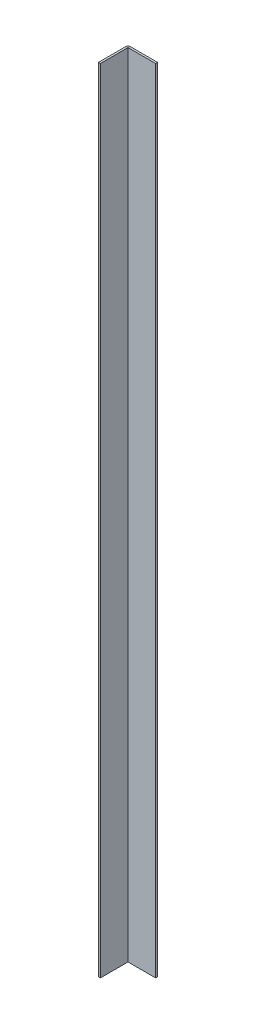
ISO-10303-21;
HEADER;
FILE_DESCRIPTION(('STEP AP214'),'2;1');
FILE_NAME('part.step','',(''),(''),'','','');
FILE_SCHEMA(('AUTOMOTIVE_DESIGN { 1 0 10303 214 1 1 1 1 }'));
ENDSEC;
DATA;
#1=APPLICATION_CONTEXT('core data for automotive mechanical design processes');
#2=APPLICATION_PROTOCOL_DEFINITION('international standard','automotive_design',2000,#1);
#3=PRODUCT_CONTEXT('',#1,'mechanical');
#4=PRODUCT('Part','Part','',(#3));
#5=PRODUCT_RELATED_PRODUCT_CATEGORY('part','',(#4));
#6=PRODUCT_DEFINITION_FORMATION('','',#4);
#7=PRODUCT_DEFINITION_CONTEXT('part definition',#1,'design');
#8=PRODUCT_DEFINITION('design','',#6,#7);
#9=PRODUCT_DEFINITION_SHAPE('','',#8);
#10=(LENGTH_UNIT() NAMED_UNIT(*) SI_UNIT(.MILLI.,.METRE.));
#11=(NAMED_UNIT(*) PLANE_ANGLE_UNIT() SI_UNIT($,.RADIAN.));
#12=(NAMED_UNIT(*) SI_UNIT($,.STERADIAN.) SOLID_ANGLE_UNIT());
#13=UNCERTAINTY_MEASURE_WITH_UNIT(LENGTH_MEASURE(1.E-05),#10,'distance_accuracy_value','');
#14=(GEOMETRIC_REPRESENTATION_CONTEXT(3) GLOBAL_UNCERTAINTY_ASSIGNED_CONTEXT((#13)) GLOBAL_UNIT_ASSIGNED_CONTEXT((#10,
#11,#12)) REPRESENTATION_CONTEXT('',''));
#15=CARTESIAN_POINT('',(0.,0.,0.));
#16=DIRECTION('',(0.,0.,1.));
#17=DIRECTION('',(1.,0.,0.));
#18=AXIS2_PLACEMENT_3D('',#15,#16,#17);
#19=CARTESIAN_POINT('',(-1240.,521.213203435596,850.482879267258));
#20=DIRECTION('',(1.,0.,0.));
#21=DIRECTION('',(0.,0.,-1.));
#22=AXIS2_PLACEMENT_3D('',#19,#20,#21);
#23=PLANE('',#22);
#24=DIRECTION('',(0.,0.,-1.));
#25=VECTOR('',#24,1.);
#26=CARTESIAN_POINT('',(-1240.,100.,850.482879267258));
#27=LINE('',#26,#25);
#28=CARTESIAN_POINT('',(-1240.,100.,50.9999999999999));
#29=VERTEX_POINT('',#28);
#30=CARTESIAN_POINT('',(-1240.,100.,50.));
#31=VERTEX_POINT('',#30);
#32=EDGE_CURVE('E185',#29,#31,#27,.T.);
#33=ORIENTED_EDGE('',*,*,#32,.T.);
#34=DIRECTION('',(0.,-1.,0.));
#35=VECTOR('',#34,1.);
#36=CARTESIAN_POINT('',(-1240.,521.213203435596,49.9999999999998));
#37=LINE('',#36,#35);
#38=CARTESIAN_POINT('',(-1240.,500.,49.9999999999998));
#39=VERTEX_POINT('',#38);
#40=EDGE_CURVE('E161',#39,#31,#37,.T.);
#41=ORIENTED_EDGE('',*,*,#40,.F.);
#42=DIRECTION('',(0.,0.,-1.));
#43=VECTOR('',#42,1.);
#44=CARTESIAN_POINT('',(-1240.,500.,850.482879267258));
#45=LINE('',#44,#43);
#46=CARTESIAN_POINT('',(-1240.,500.,51.0000000000002));
#47=VERTEX_POINT('',#46);
#48=EDGE_CURVE('E247',#47,#39,#45,.T.);
#49=ORIENTED_EDGE('',*,*,#48,.F.);
#50=DIRECTION('',(0.,-1.,0.));
#51=VECTOR('',#50,1.);
#52=CARTESIAN_POINT('',(-1240.,521.213203435596,50.9999999999999));
#53=LINE('',#52,#51);
#54=EDGE_CURVE('E77',#47,#29,#53,.T.);
#55=ORIENTED_EDGE('',*,*,#54,.T.);
#56=EDGE_LOOP('',(#33,#41,#49,#55));
#57=FACE_BOUND('',#56,.T.);
#58=ADVANCED_FACE('F53',(#57),#23,.T.);
#59=CARTESIAN_POINT('',(-1255.,100.,850.482879267258));
#60=DIRECTION('',(0.,1.,0.));
#61=DIRECTION('',(-1.,0.,0.));
#62=AXIS2_PLACEMENT_3D('',#59,#60,#61);
#63=PLANE('',#62);
#64=DIRECTION('',(1.,0.,0.));
#65=VECTOR('',#64,1.);
#66=CARTESIAN_POINT('',(-1255.,100.,49.9999999999998));
#67=LINE('',#66,#65);
#68=CARTESIAN_POINT('',(-1253.9,100.,50.));
#69=VERTEX_POINT('',#68);
#70=EDGE_CURVE('E152',#69,#31,#67,.T.);
#71=ORIENTED_EDGE('',*,*,#70,.T.);
#72=ORIENTED_EDGE('',*,*,#32,.F.);
#73=DIRECTION('',(1.,0.,0.));
#74=VECTOR('',#73,1.);
#75=CARTESIAN_POINT('',(-1255.,100.,50.9999999999999));
#76=LINE('',#75,#74);
#77=CARTESIAN_POINT('',(-1253.9,100.,50.9999999999999));
#78=VERTEX_POINT('',#77);
#79=EDGE_CURVE('E12',#78,#29,#76,.T.);
#80=ORIENTED_EDGE('',*,*,#79,.F.);
#81=DIRECTION('',(0.,0.,-1.));
#82=VECTOR('',#81,1.);
#83=CARTESIAN_POINT('',(-1253.9,100.,850.482879267258));
#84=LINE('',#83,#82);
#85=EDGE_CURVE('E166',#78,#69,#84,.T.);
#86=ORIENTED_EDGE('',*,*,#85,.T.);
#87=EDGE_LOOP('',(#71,#72,#80,#86));
#88=FACE_BOUND('',#87,.T.);
#89=ADVANCED_FACE('F169',(#88),#63,.F.);
#90=CARTESIAN_POINT('',(-1255.,521.213203435596,49.9999999999998));
#91=DIRECTION('',(0.,0.,-1.));
#92=DIRECTION('',(-1.,0.,0.));
#93=AXIS2_PLACEMENT_3D('',#90,#91,#92);
#94=PLANE('',#93);
#95=DIRECTION('',(0.,-1.,0.));
#96=VECTOR('',#95,1.);
#97=CARTESIAN_POINT('',(-1253.9,100.,49.9999999999998));
#98=LINE('',#97,#96);
#99=CARTESIAN_POINT('',(-1253.9,500.,50.));
#100=VERTEX_POINT('',#99);
#101=EDGE_CURVE('E158',#100,#69,#98,.T.);
#102=ORIENTED_EDGE('',*,*,#101,.F.);
#103=DIRECTION('',(-1.,0.,0.));
#104=VECTOR('',#103,1.);
#105=CARTESIAN_POINT('',(-1255.,500.,49.9999999999998));
#106=LINE('',#105,#104);
#107=EDGE_CURVE('E250',#39,#100,#106,.T.);
#108=ORIENTED_EDGE('',*,*,#107,.F.);
#109=ORIENTED_EDGE('',*,*,#40,.T.);
#110=ORIENTED_EDGE('',*,*,#70,.F.);
#111=EDGE_LOOP('',(#102,#108,#109,#110));
#112=FACE_BOUND('',#111,.T.);
#113=ADVANCED_FACE('F155',(#112),#94,.T.);
#114=CARTESIAN_POINT('',(-1255.,500.,850.482879267258));
#115=DIRECTION('',(0.,-1.,0.));
#116=DIRECTION('',(1.,0.,0.));
#117=AXIS2_PLACEMENT_3D('',#114,#115,#116);
#118=PLANE('',#117);
#119=ORIENTED_EDGE('',*,*,#107,.T.);
#120=DIRECTION('',(0.,0.,-1.));
#121=VECTOR('',#120,1.);
#122=CARTESIAN_POINT('',(-1253.9,500.,850.482879267258));
#123=LINE('',#122,#121);
#124=CARTESIAN_POINT('',(-1253.9,500.,50.9999999999999));
#125=VERTEX_POINT('',#124);
#126=EDGE_CURVE('E58',#125,#100,#123,.T.);
#127=ORIENTED_EDGE('',*,*,#126,.F.);
#128=DIRECTION('',(-1.,0.,0.));
#129=VECTOR('',#128,1.);
#130=CARTESIAN_POINT('',(-1255.,500.,50.9999999999999));
#131=LINE('',#130,#129);
#132=EDGE_CURVE('E100',#47,#125,#131,.T.);
#133=ORIENTED_EDGE('',*,*,#132,.F.);
#134=ORIENTED_EDGE('',*,*,#48,.T.);
#135=EDGE_LOOP('',(#119,#127,#133,#134));
#136=FACE_BOUND('',#135,.T.);
#137=ADVANCED_FACE('F328',(#136),#118,.F.);
#138=CARTESIAN_POINT('',(-1255.,521.213203435596,50.9999999999999));
#139=DIRECTION('',(0.,0.,-1.));
#140=DIRECTION('',(-1.,0.,0.));
#141=AXIS2_PLACEMENT_3D('',#138,#139,#140);
#142=PLANE('',#141);
#143=ORIENTED_EDGE('',*,*,#132,.T.);
#144=DIRECTION('',(0.,-1.,0.));
#145=VECTOR('',#144,1.);
#146=CARTESIAN_POINT('',(-1253.9,100.,50.9999999999999));
#147=LINE('',#146,#145);
#148=EDGE_CURVE('E65',#125,#78,#147,.T.);
#149=ORIENTED_EDGE('',*,*,#148,.T.);
#150=ORIENTED_EDGE('',*,*,#79,.T.);
#151=ORIENTED_EDGE('',*,*,#54,.F.);
#152=EDGE_LOOP('',(#143,#149,#150,#151));
#153=FACE_BOUND('',#152,.T.);
#154=ADVANCED_FACE('F56',(#153),#142,.F.);
#155=CARTESIAN_POINT('',(-454.517120732742,100.,65.));
#156=DIRECTION('',(0.,1.,0.));
#157=DIRECTION('',(0.,0.,1.));
#158=AXIS2_PLACEMENT_3D('',#155,#156,#157);
#159=PLANE('',#158);
#160=DIRECTION('',(0.,0.,-1.));
#161=VECTOR('',#160,1.);
#162=CARTESIAN_POINT('',(-1255.,100.,65.));
#163=LINE('',#162,#161);
#164=CARTESIAN_POINT('',(-1255.,100.,65.));
#165=VERTEX_POINT('',#164);
#166=CARTESIAN_POINT('',(-1255.,100.,51.1));
#167=VERTEX_POINT('',#166);
#168=EDGE_CURVE('E277',#165,#167,#163,.T.);
#169=ORIENTED_EDGE('',*,*,#168,.T.);
#170=DIRECTION('',(-1.,0.,0.));
#171=VECTOR('',#170,1.);
#172=CARTESIAN_POINT('',(-454.517120732742,100.,51.1));
#173=LINE('',#172,#171);
#174=CARTESIAN_POINT('',(-1254.,100.,51.1));
#175=VERTEX_POINT('',#174);
#176=EDGE_CURVE('E188',#175,#167,#173,.T.);
#177=ORIENTED_EDGE('',*,*,#176,.F.);
#178=DIRECTION('',(0.,0.,-1.));
#179=VECTOR('',#178,1.);
#180=CARTESIAN_POINT('',(-1254.,100.,65.));
#181=LINE('',#180,#179);
#182=CARTESIAN_POINT('',(-1254.,100.,65.));
#183=VERTEX_POINT('',#182);
#184=EDGE_CURVE('E214',#183,#175,#181,.T.);
#185=ORIENTED_EDGE('',*,*,#184,.F.);
#186=DIRECTION('',(-1.,0.,0.));
#187=VECTOR('',#186,1.);
#188=CARTESIAN_POINT('',(-454.517120732742,100.,65.));
#189=LINE('',#188,#187);
#190=EDGE_CURVE('E213',#183,#165,#189,.T.);
#191=ORIENTED_EDGE('',*,*,#190,.T.);
#192=EDGE_LOOP('',(#169,#177,#185,#191));
#193=FACE_BOUND('',#192,.T.);
#194=ADVANCED_FACE('F308',(#193),#159,.F.);
#195=CARTESIAN_POINT('',(-454.517120732742,500.,65.));
#196=DIRECTION('',(0.,-1.,0.));
#197=DIRECTION('',(0.,0.,-1.));
#198=AXIS2_PLACEMENT_3D('',#195,#196,#197);
#199=PLANE('',#198);
#200=DIRECTION('',(0.,0.,1.));
#201=VECTOR('',#200,1.);
#202=CARTESIAN_POINT('',(-1255.,500.,65.));
#203=LINE('',#202,#201);
#204=CARTESIAN_POINT('',(-1255.,500.,51.1));
#205=VERTEX_POINT('',#204);
#206=CARTESIAN_POINT('',(-1255.,500.,65.));
#207=VERTEX_POINT('',#206);
#208=EDGE_CURVE('E194',#205,#207,#203,.T.);
#209=ORIENTED_EDGE('',*,*,#208,.T.);
#210=DIRECTION('',(-1.,0.,0.));
#211=VECTOR('',#210,1.);
#212=CARTESIAN_POINT('',(-454.517120732742,500.,65.));
#213=LINE('',#212,#211);
#214=CARTESIAN_POINT('',(-1254.,500.,65.));
#215=VERTEX_POINT('',#214);
#216=EDGE_CURVE('E219',#215,#207,#213,.T.);
#217=ORIENTED_EDGE('',*,*,#216,.F.);
#218=DIRECTION('',(0.,0.,1.));
#219=VECTOR('',#218,1.);
#220=CARTESIAN_POINT('',(-1254.,500.,65.));
#221=LINE('',#220,#219);
#222=CARTESIAN_POINT('',(-1254.,500.,51.1));
#223=VERTEX_POINT('',#222);
#224=EDGE_CURVE('E270',#223,#215,#221,.T.);
#225=ORIENTED_EDGE('',*,*,#224,.F.);
#226=DIRECTION('',(-1.,0.,0.));
#227=VECTOR('',#226,1.);
#228=CARTESIAN_POINT('',(-454.517120732742,500.,51.1));
#229=LINE('',#228,#227);
#230=EDGE_CURVE('E113',#223,#205,#229,.T.);
#231=ORIENTED_EDGE('',*,*,#230,.T.);
#232=EDGE_LOOP('',(#209,#217,#225,#231));
#233=FACE_BOUND('',#232,.T.);
#234=ADVANCED_FACE('F300',(#233),#199,.F.);
#235=CARTESIAN_POINT('',(-454.517120732742,521.213203435596,65.));
#236=DIRECTION('',(0.,0.,-1.));
#237=DIRECTION('',(-1.,0.,0.));
#238=AXIS2_PLACEMENT_3D('',#235,#236,#237);
#239=PLANE('',#238);
#240=DIRECTION('',(0.,-1.,0.));
#241=VECTOR('',#240,1.);
#242=CARTESIAN_POINT('',(-1255.,521.213203435596,65.));
#243=LINE('',#242,#241);
#244=EDGE_CURVE('E123',#207,#165,#243,.T.);
#245=ORIENTED_EDGE('',*,*,#244,.T.);
#246=ORIENTED_EDGE('',*,*,#190,.F.);
#247=DIRECTION('',(0.,-1.,0.));
#248=VECTOR('',#247,1.);
#249=CARTESIAN_POINT('',(-1254.,521.213203435596,65.));
#250=LINE('',#249,#248);
#251=EDGE_CURVE('E268',#215,#183,#250,.T.);
#252=ORIENTED_EDGE('',*,*,#251,.F.);
#253=ORIENTED_EDGE('',*,*,#216,.T.);
#254=EDGE_LOOP('',(#245,#246,#252,#253));
#255=FACE_BOUND('',#254,.T.);
#256=ADVANCED_FACE('F309',(#255),#239,.F.);
#257=CARTESIAN_POINT('',(-1254.,521.213203435596,65.));
#258=DIRECTION('',(-1.,0.,0.));
#259=DIRECTION('',(0.,0.,1.));
#260=AXIS2_PLACEMENT_3D('',#257,#258,#259);
#261=PLANE('',#260);
#262=DIRECTION('',(0.,-1.,0.));
#263=VECTOR('',#262,1.);
#264=CARTESIAN_POINT('',(-1254.,100.,51.1));
#265=LINE('',#264,#263);
#266=EDGE_CURVE('E208',#223,#175,#265,.T.);
#267=ORIENTED_EDGE('',*,*,#266,.F.);
#268=ORIENTED_EDGE('',*,*,#224,.T.);
#269=ORIENTED_EDGE('',*,*,#251,.T.);
#270=ORIENTED_EDGE('',*,*,#184,.T.);
#271=EDGE_LOOP('',(#267,#268,#269,#270));
#272=FACE_BOUND('',#271,.T.);
#273=ADVANCED_FACE('F297',(#272),#261,.F.);
#274=CARTESIAN_POINT('',(-1255.,521.213203435596,65.));
#275=DIRECTION('',(-1.,0.,0.));
#276=DIRECTION('',(0.,0.,1.));
#277=AXIS2_PLACEMENT_3D('',#274,#275,#276);
#278=PLANE('',#277);
#279=ORIENTED_EDGE('',*,*,#208,.F.);
#280=DIRECTION('',(0.,-1.,0.));
#281=VECTOR('',#280,1.);
#282=CARTESIAN_POINT('',(-1255.,100.,51.1));
#283=LINE('',#282,#281);
#284=EDGE_CURVE('E272',#205,#167,#283,.T.);
#285=ORIENTED_EDGE('',*,*,#284,.T.);
#286=ORIENTED_EDGE('',*,*,#168,.F.);
#287=ORIENTED_EDGE('',*,*,#244,.F.);
#288=EDGE_LOOP('',(#279,#285,#286,#287));
#289=FACE_BOUND('',#288,.T.);
#290=ADVANCED_FACE('F306',(#289),#278,.T.);
#291=CARTESIAN_POINT('',(-1253.9,100.,51.1));
#292=DIRECTION('',(0.,-1.,0.));
#293=DIRECTION('',(0.,0.,-1.));
#294=AXIS2_PLACEMENT_3D('',#291,#292,#293);
#295=PLANE('',#294);
#296=ORIENTED_EDGE('',*,*,#85,.F.);
#297=CARTESIAN_POINT('',(-1253.9,100.,51.1));
#298=DIRECTION('',(0.,1.,0.));
#299=DIRECTION('',(0.,0.,1.));
#300=AXIS2_PLACEMENT_3D('',#297,#298,#299);
#301=CIRCLE('',#300,0.100000000000049);
#302=EDGE_CURVE('E197',#78,#175,#301,.T.);
#303=ORIENTED_EDGE('',*,*,#302,.T.);
#304=ORIENTED_EDGE('',*,*,#176,.T.);
#305=CARTESIAN_POINT('',(-1253.9,100.,51.1));
#306=DIRECTION('',(0.,1.,0.));
#307=DIRECTION('',(0.,0.,1.));
#308=AXIS2_PLACEMENT_3D('',#305,#306,#307);
#309=CIRCLE('',#308,1.09999999999994);
#310=EDGE_CURVE('E181',#69,#167,#309,.T.);
#311=ORIENTED_EDGE('',*,*,#310,.F.);
#312=EDGE_LOOP('',(#296,#303,#304,#311));
#313=FACE_BOUND('',#312,.T.);
#314=ADVANCED_FACE('F187',(#313),#295,.T.);
#315=CARTESIAN_POINT('',(-1253.9,500.,51.1));
#316=DIRECTION('',(0.,1.,0.));
#317=DIRECTION('',(0.,0.,1.));
#318=AXIS2_PLACEMENT_3D('',#315,#316,#317);
#319=PLANE('',#318);
#320=CARTESIAN_POINT('',(-1253.9,500.,51.1));
#321=DIRECTION('',(0.,1.,0.));
#322=DIRECTION('',(0.,0.,1.));
#323=AXIS2_PLACEMENT_3D('',#320,#321,#322);
#324=CIRCLE('',#323,0.100000000000049);
#325=EDGE_CURVE('E190',#223,#125,#324,.F.);
#326=ORIENTED_EDGE('',*,*,#325,.T.);
#327=ORIENTED_EDGE('',*,*,#126,.T.);
#328=CARTESIAN_POINT('',(-1253.9,500.,51.1));
#329=DIRECTION('',(0.,1.,0.));
#330=DIRECTION('',(0.,0.,1.));
#331=AXIS2_PLACEMENT_3D('',#328,#329,#330);
#332=CIRCLE('',#331,1.09999999999994);
#333=EDGE_CURVE('E183',#205,#100,#332,.F.);
#334=ORIENTED_EDGE('',*,*,#333,.F.);
#335=ORIENTED_EDGE('',*,*,#230,.F.);
#336=EDGE_LOOP('',(#326,#327,#334,#335));
#337=FACE_BOUND('',#336,.T.);
#338=ADVANCED_FACE('F302',(#337),#319,.T.);
#339=CARTESIAN_POINT('',(-1253.9,-301.00110972415,51.1));
#340=DIRECTION('',(0.,1.,0.));
#341=DIRECTION('',(0.,0.,1.));
#342=AXIS2_PLACEMENT_3D('',#339,#340,#341);
#343=CYLINDRICAL_SURFACE('',#342,1.09999999999994);
#344=ORIENTED_EDGE('',*,*,#284,.F.);
#345=ORIENTED_EDGE('',*,*,#333,.T.);
#346=ORIENTED_EDGE('',*,*,#101,.T.);
#347=ORIENTED_EDGE('',*,*,#310,.T.);
#348=EDGE_LOOP('',(#344,#345,#346,#347));
#349=FACE_BOUND('',#348,.T.);
#350=ADVANCED_FACE('F180',(#349),#343,.T.);
#351=CARTESIAN_POINT('',(-1253.9,-301.00110972415,51.1));
#352=DIRECTION('',(0.,1.,0.));
#353=DIRECTION('',(0.,0.,1.));
#354=AXIS2_PLACEMENT_3D('',#351,#352,#353);
#355=CYLINDRICAL_SURFACE('',#354,0.100000000000049);
#356=ORIENTED_EDGE('',*,*,#266,.T.);
#357=ORIENTED_EDGE('',*,*,#302,.F.);
#358=ORIENTED_EDGE('',*,*,#148,.F.);
#359=ORIENTED_EDGE('',*,*,#325,.F.);
#360=EDGE_LOOP('',(#356,#357,#358,#359));
#361=FACE_BOUND('',#360,.T.);
#362=ADVANCED_FACE('F295',(#361),#355,.F.);
#363=CLOSED_SHELL('',(#58,#89,#113,#137,#154,#194,#234,#256,#273,#290,#314,#338,#350,#362));
#364=MANIFOLD_SOLID_BREP('B2',#363);
#365=ADVANCED_BREP_SHAPE_REPRESENTATION('',(#18,#364),#14);
#366=SHAPE_DEFINITION_REPRESENTATION(#9,#365);
ENDSEC;
END-ISO-10303-21;
